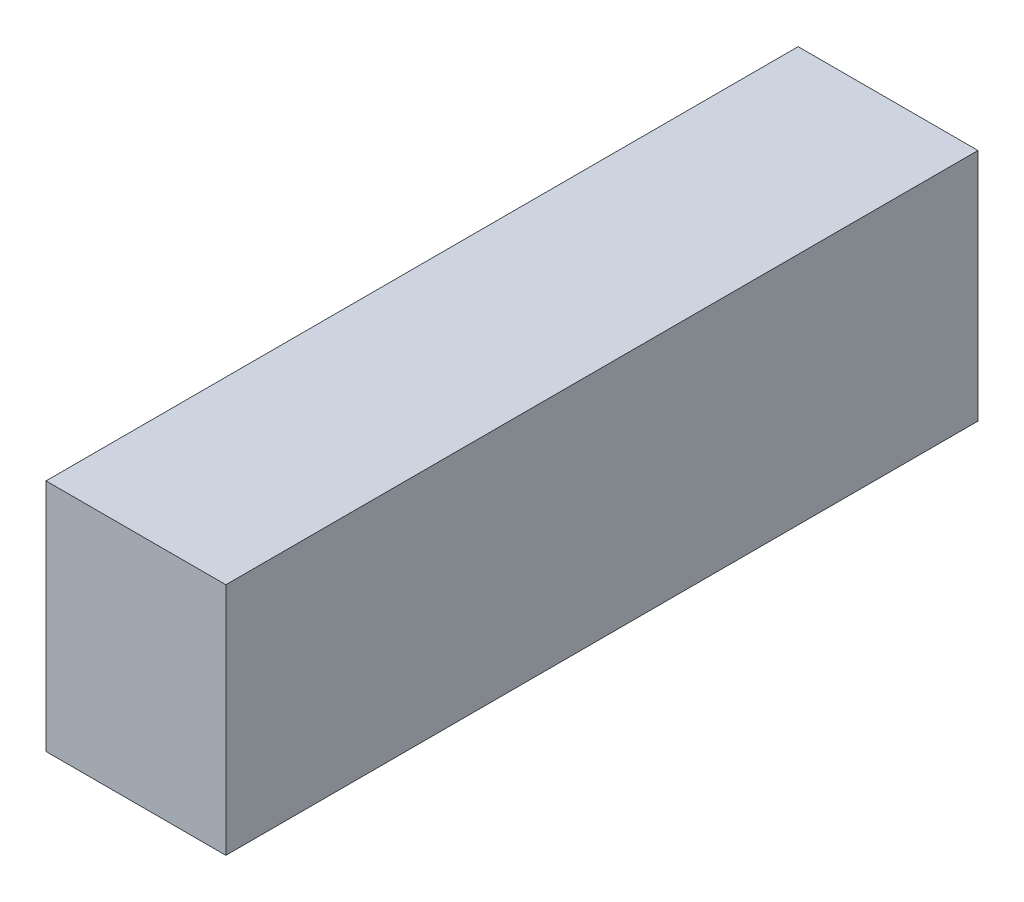
ISO-10303-21;
HEADER;
FILE_DESCRIPTION(('STEP AP214'),'2;1');
FILE_NAME('part.step','',(''),(''),'','','');
FILE_SCHEMA(('AUTOMOTIVE_DESIGN { 1 0 10303 214 1 1 1 1 }'));
ENDSEC;
DATA;
#1=APPLICATION_CONTEXT('core data for automotive mechanical design processes');
#2=APPLICATION_PROTOCOL_DEFINITION('international standard','automotive_design',2000,#1);
#3=PRODUCT_CONTEXT('',#1,'mechanical');
#4=PRODUCT('Part','Part','',(#3));
#5=PRODUCT_RELATED_PRODUCT_CATEGORY('part','',(#4));
#6=PRODUCT_DEFINITION_FORMATION('','',#4);
#7=PRODUCT_DEFINITION_CONTEXT('part definition',#1,'design');
#8=PRODUCT_DEFINITION('design','',#6,#7);
#9=PRODUCT_DEFINITION_SHAPE('','',#8);
#10=(LENGTH_UNIT() NAMED_UNIT(*) SI_UNIT(.MILLI.,.METRE.));
#11=(NAMED_UNIT(*) PLANE_ANGLE_UNIT() SI_UNIT($,.RADIAN.));
#12=(NAMED_UNIT(*) SI_UNIT($,.STERADIAN.) SOLID_ANGLE_UNIT());
#13=UNCERTAINTY_MEASURE_WITH_UNIT(LENGTH_MEASURE(1.E-05),#10,'distance_accuracy_value','');
#14=(GEOMETRIC_REPRESENTATION_CONTEXT(3) GLOBAL_UNCERTAINTY_ASSIGNED_CONTEXT((#13)) GLOBAL_UNIT_ASSIGNED_CONTEXT((#10,
#11,#12)) REPRESENTATION_CONTEXT('',''));
#15=CARTESIAN_POINT('',(0.,0.,0.));
#16=DIRECTION('',(0.,0.,1.));
#17=DIRECTION('',(1.,0.,0.));
#18=AXIS2_PLACEMENT_3D('',#15,#16,#17);
#19=CARTESIAN_POINT('',(33.,0.,0.));
#20=DIRECTION('',(0.,0.,-1.));
#21=DIRECTION('',(0.,1.,0.));
#22=AXIS2_PLACEMENT_3D('',#19,#20,#21);
#23=PLANE('',#22);
#24=DIRECTION('',(0.,-1.,0.));
#25=VECTOR('',#24,1.);
#26=CARTESIAN_POINT('',(0.,0.,0.));
#27=LINE('',#26,#25);
#28=CARTESIAN_POINT('',(0.,0.,0.));
#29=VERTEX_POINT('',#28);
#30=CARTESIAN_POINT('',(0.,-43.,0.));
#31=VERTEX_POINT('',#30);
#32=EDGE_CURVE('E95',#29,#31,#27,.T.);
#33=ORIENTED_EDGE('',*,*,#32,.T.);
#34=DIRECTION('',(-1.,0.,0.));
#35=VECTOR('',#34,1.);
#36=CARTESIAN_POINT('',(33.,-43.,0.));
#37=LINE('',#36,#35);
#38=CARTESIAN_POINT('',(33.,-43.,0.));
#39=VERTEX_POINT('',#38);
#40=EDGE_CURVE('E11',#39,#31,#37,.T.);
#41=ORIENTED_EDGE('',*,*,#40,.F.);
#42=DIRECTION('',(0.,-1.,0.));
#43=VECTOR('',#42,1.);
#44=CARTESIAN_POINT('',(33.,0.,0.));
#45=LINE('',#44,#43);
#46=CARTESIAN_POINT('',(33.,0.,0.));
#47=VERTEX_POINT('',#46);
#48=EDGE_CURVE('E83',#47,#39,#45,.T.);
#49=ORIENTED_EDGE('',*,*,#48,.F.);
#50=DIRECTION('',(-1.,0.,0.));
#51=VECTOR('',#50,1.);
#52=CARTESIAN_POINT('',(33.,0.,0.));
#53=LINE('',#52,#51);
#54=EDGE_CURVE('E91',#47,#29,#53,.T.);
#55=ORIENTED_EDGE('',*,*,#54,.T.);
#56=EDGE_LOOP('',(#33,#41,#49,#55));
#57=FACE_BOUND('',#56,.T.);
#58=ADVANCED_FACE('F32',(#57),#23,.F.);
#59=CARTESIAN_POINT('',(33.,-43.,0.));
#60=DIRECTION('',(0.,1.,0.));
#61=DIRECTION('',(0.,0.,1.));
#62=AXIS2_PLACEMENT_3D('',#59,#60,#61);
#63=PLANE('',#62);
#64=DIRECTION('',(0.,0.,-1.));
#65=VECTOR('',#64,1.);
#66=CARTESIAN_POINT('',(0.,-43.,0.));
#67=LINE('',#66,#65);
#68=CARTESIAN_POINT('',(0.,-43.,-138.));
#69=VERTEX_POINT('',#68);
#70=EDGE_CURVE('E87',#31,#69,#67,.T.);
#71=ORIENTED_EDGE('',*,*,#70,.T.);
#72=DIRECTION('',(-1.,0.,0.));
#73=VECTOR('',#72,1.);
#74=CARTESIAN_POINT('',(33.,-43.,-138.));
#75=LINE('',#74,#73);
#76=CARTESIAN_POINT('',(33.,-43.,-138.));
#77=VERTEX_POINT('',#76);
#78=EDGE_CURVE('E40',#77,#69,#75,.T.);
#79=ORIENTED_EDGE('',*,*,#78,.F.);
#80=DIRECTION('',(0.,0.,-1.));
#81=VECTOR('',#80,1.);
#82=CARTESIAN_POINT('',(33.,-43.,0.));
#83=LINE('',#82,#81);
#84=EDGE_CURVE('E78',#39,#77,#83,.T.);
#85=ORIENTED_EDGE('',*,*,#84,.F.);
#86=ORIENTED_EDGE('',*,*,#40,.T.);
#87=EDGE_LOOP('',(#71,#79,#85,#86));
#88=FACE_BOUND('',#87,.T.);
#89=ADVANCED_FACE('F86',(#88),#63,.F.);
#90=CARTESIAN_POINT('',(33.,0.,-138.));
#91=DIRECTION('',(0.,0.,1.));
#92=DIRECTION('',(1.,0.,0.));
#93=AXIS2_PLACEMENT_3D('',#90,#91,#92);
#94=PLANE('',#93);
#95=DIRECTION('',(0.,1.,0.));
#96=VECTOR('',#95,1.);
#97=CARTESIAN_POINT('',(0.,0.,-138.));
#98=LINE('',#97,#96);
#99=CARTESIAN_POINT('',(0.,0.,-138.));
#100=VERTEX_POINT('',#99);
#101=EDGE_CURVE('E65',#69,#100,#98,.T.);
#102=ORIENTED_EDGE('',*,*,#101,.T.);
#103=DIRECTION('',(-1.,0.,0.));
#104=VECTOR('',#103,1.);
#105=CARTESIAN_POINT('',(33.,0.,-138.));
#106=LINE('',#105,#104);
#107=CARTESIAN_POINT('',(33.,0.,-138.));
#108=VERTEX_POINT('',#107);
#109=EDGE_CURVE('E88',#108,#100,#106,.T.);
#110=ORIENTED_EDGE('',*,*,#109,.F.);
#111=DIRECTION('',(0.,1.,0.));
#112=VECTOR('',#111,1.);
#113=CARTESIAN_POINT('',(33.,0.,-138.));
#114=LINE('',#113,#112);
#115=EDGE_CURVE('E81',#77,#108,#114,.T.);
#116=ORIENTED_EDGE('',*,*,#115,.F.);
#117=ORIENTED_EDGE('',*,*,#78,.T.);
#118=EDGE_LOOP('',(#102,#110,#116,#117));
#119=FACE_BOUND('',#118,.T.);
#120=ADVANCED_FACE('F89',(#119),#94,.F.);
#121=CARTESIAN_POINT('',(33.,0.,0.));
#122=DIRECTION('',(0.,-1.,0.));
#123=DIRECTION('',(0.,0.,-1.));
#124=AXIS2_PLACEMENT_3D('',#121,#122,#123);
#125=PLANE('',#124);
#126=DIRECTION('',(0.,0.,1.));
#127=VECTOR('',#126,1.);
#128=CARTESIAN_POINT('',(0.,0.,0.));
#129=LINE('',#128,#127);
#130=EDGE_CURVE('E71',#100,#29,#129,.T.);
#131=ORIENTED_EDGE('',*,*,#130,.T.);
#132=ORIENTED_EDGE('',*,*,#54,.F.);
#133=DIRECTION('',(0.,0.,1.));
#134=VECTOR('',#133,1.);
#135=CARTESIAN_POINT('',(33.,0.,0.));
#136=LINE('',#135,#134);
#137=EDGE_CURVE('E48',#108,#47,#136,.T.);
#138=ORIENTED_EDGE('',*,*,#137,.F.);
#139=ORIENTED_EDGE('',*,*,#109,.T.);
#140=EDGE_LOOP('',(#131,#132,#138,#139));
#141=FACE_BOUND('',#140,.T.);
#142=ADVANCED_FACE('F102',(#141),#125,.F.);
#143=CARTESIAN_POINT('',(33.,0.,0.));
#144=DIRECTION('',(1.,0.,0.));
#145=DIRECTION('',(0.,0.,-1.));
#146=AXIS2_PLACEMENT_3D('',#143,#144,#145);
#147=PLANE('',#146);
#148=ORIENTED_EDGE('',*,*,#48,.T.);
#149=ORIENTED_EDGE('',*,*,#84,.T.);
#150=ORIENTED_EDGE('',*,*,#115,.T.);
#151=ORIENTED_EDGE('',*,*,#137,.T.);
#152=EDGE_LOOP('',(#148,#149,#150,#151));
#153=FACE_BOUND('',#152,.T.);
#154=ADVANCED_FACE('F79',(#153),#147,.T.);
#155=CARTESIAN_POINT('',(0.,0.,0.));
#156=DIRECTION('',(1.,0.,0.));
#157=DIRECTION('',(0.,0.,-1.));
#158=AXIS2_PLACEMENT_3D('',#155,#156,#157);
#159=PLANE('',#158);
#160=ORIENTED_EDGE('',*,*,#32,.F.);
#161=ORIENTED_EDGE('',*,*,#130,.F.);
#162=ORIENTED_EDGE('',*,*,#101,.F.);
#163=ORIENTED_EDGE('',*,*,#70,.F.);
#164=EDGE_LOOP('',(#160,#161,#162,#163));
#165=FACE_BOUND('',#164,.T.);
#166=ADVANCED_FACE('F105',(#165),#159,.F.);
#167=CLOSED_SHELL('',(#58,#89,#120,#142,#154,#166));
#168=MANIFOLD_SOLID_BREP('B2',#167);
#169=ADVANCED_BREP_SHAPE_REPRESENTATION('',(#18,#168),#14);
#170=SHAPE_DEFINITION_REPRESENTATION(#9,#169);
ENDSEC;
END-ISO-10303-21;
